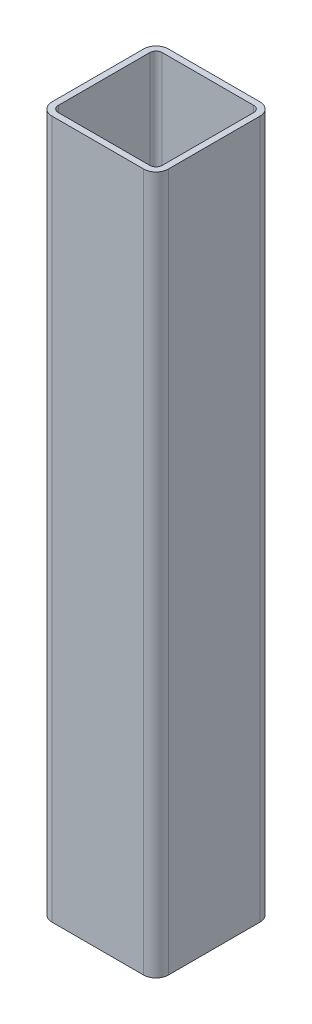
ISO-10303-21;
HEADER;
FILE_DESCRIPTION(('STEP AP214'),'2;1');
FILE_NAME('part.step','',(''),(''),'','','');
FILE_SCHEMA(('AUTOMOTIVE_DESIGN { 1 0 10303 214 1 1 1 1 }'));
ENDSEC;
DATA;
#1=APPLICATION_CONTEXT('core data for automotive mechanical design processes');
#2=APPLICATION_PROTOCOL_DEFINITION('international standard','automotive_design',2000,#1);
#3=PRODUCT_CONTEXT('',#1,'mechanical');
#4=PRODUCT('Part','Part','',(#3));
#5=PRODUCT_RELATED_PRODUCT_CATEGORY('part','',(#4));
#6=PRODUCT_DEFINITION_FORMATION('','',#4);
#7=PRODUCT_DEFINITION_CONTEXT('part definition',#1,'design');
#8=PRODUCT_DEFINITION('design','',#6,#7);
#9=PRODUCT_DEFINITION_SHAPE('','',#8);
#10=(LENGTH_UNIT() NAMED_UNIT(*) SI_UNIT(.MILLI.,.METRE.));
#11=(NAMED_UNIT(*) PLANE_ANGLE_UNIT() SI_UNIT($,.RADIAN.));
#12=(NAMED_UNIT(*) SI_UNIT($,.STERADIAN.) SOLID_ANGLE_UNIT());
#13=UNCERTAINTY_MEASURE_WITH_UNIT(LENGTH_MEASURE(1.E-05),#10,'distance_accuracy_value','');
#14=(GEOMETRIC_REPRESENTATION_CONTEXT(3) GLOBAL_UNCERTAINTY_ASSIGNED_CONTEXT((#13)) GLOBAL_UNIT_ASSIGNED_CONTEXT((#10,
#11,#12)) REPRESENTATION_CONTEXT('',''));
#15=CARTESIAN_POINT('',(0.,0.,0.));
#16=DIRECTION('',(0.,0.,1.));
#17=DIRECTION('',(1.,0.,0.));
#18=AXIS2_PLACEMENT_3D('',#15,#16,#17);
#19=CARTESIAN_POINT('',(646.4,300.,-1193.6));
#20=DIRECTION('',(0.,-1.,0.));
#21=DIRECTION('',(0.,0.,-1.));
#22=AXIS2_PLACEMENT_3D('',#19,#20,#21);
#23=CYLINDRICAL_SURFACE('',#22,3.20000000000009);
#24=CARTESIAN_POINT('',(646.4,330.,-1193.6));
#25=DIRECTION('',(0.,-1.,0.));
#26=DIRECTION('',(0.,0.,-1.));
#27=AXIS2_PLACEMENT_3D('',#24,#25,#26);
#28=CIRCLE('',#27,3.20000000000009);
#29=CARTESIAN_POINT('',(643.2,330.,-1193.6));
#30=VERTEX_POINT('',#29);
#31=CARTESIAN_POINT('',(646.4,330.,-1196.8));
#32=VERTEX_POINT('',#31);
#33=EDGE_CURVE('E141',#30,#32,#28,.T.);
#34=ORIENTED_EDGE('',*,*,#33,.F.);
#35=DIRECTION('',(0.,1.,0.));
#36=VECTOR('',#35,1.);
#37=CARTESIAN_POINT('',(643.2,300.,-1193.6));
#38=LINE('',#37,#36);
#39=CARTESIAN_POINT('',(643.2,-30.,-1193.6));
#40=VERTEX_POINT('',#39);
#41=EDGE_CURVE('E140',#40,#30,#38,.T.);
#42=ORIENTED_EDGE('',*,*,#41,.F.);
#43=CARTESIAN_POINT('',(646.4,-30.,-1193.6));
#44=DIRECTION('',(0.,-1.,0.));
#45=DIRECTION('',(0.,0.,-1.));
#46=AXIS2_PLACEMENT_3D('',#43,#44,#45);
#47=CIRCLE('',#46,3.20000000000009);
#48=CARTESIAN_POINT('',(646.4,-30.,-1196.8));
#49=VERTEX_POINT('',#48);
#50=EDGE_CURVE('E19',#49,#40,#47,.F.);
#51=ORIENTED_EDGE('',*,*,#50,.F.);
#52=DIRECTION('',(0.,1.,0.));
#53=VECTOR('',#52,1.);
#54=CARTESIAN_POINT('',(646.4,300.,-1196.8));
#55=LINE('',#54,#53);
#56=EDGE_CURVE('E123',#32,#49,#55,.F.);
#57=ORIENTED_EDGE('',*,*,#56,.F.);
#58=EDGE_LOOP('',(#34,#42,#51,#57));
#59=FACE_BOUND('',#58,.T.);
#60=ADVANCED_FACE('F16',(#59),#23,.F.);
#61=CARTESIAN_POINT('',(693.6,300.,-1196.8));
#62=DIRECTION('',(0.,0.,1.));
#63=DIRECTION('',(1.,0.,0.));
#64=AXIS2_PLACEMENT_3D('',#61,#62,#63);
#65=PLANE('',#64);
#66=ORIENTED_EDGE('',*,*,#56,.T.);
#67=DIRECTION('',(1.,0.,0.));
#68=VECTOR('',#67,1.);
#69=CARTESIAN_POINT('',(-670.,-30.,-1196.8));
#70=LINE('',#69,#68);
#71=CARTESIAN_POINT('',(693.6,-30.,-1196.8));
#72=VERTEX_POINT('',#71);
#73=EDGE_CURVE('E136',#72,#49,#70,.F.);
#74=ORIENTED_EDGE('',*,*,#73,.F.);
#75=DIRECTION('',(0.,-1.,0.));
#76=VECTOR('',#75,1.);
#77=CARTESIAN_POINT('',(693.6,300.,-1196.8));
#78=LINE('',#77,#76);
#79=CARTESIAN_POINT('',(693.6,330.,-1196.8));
#80=VERTEX_POINT('',#79);
#81=EDGE_CURVE('E182',#72,#80,#78,.F.);
#82=ORIENTED_EDGE('',*,*,#81,.T.);
#83=DIRECTION('',(1.,0.,0.));
#84=VECTOR('',#83,1.);
#85=CARTESIAN_POINT('',(-3.33066907387547E-13,330.,-1196.8));
#86=LINE('',#85,#84);
#87=EDGE_CURVE('E209',#32,#80,#86,.T.);
#88=ORIENTED_EDGE('',*,*,#87,.F.);
#89=EDGE_LOOP('',(#66,#74,#82,#88));
#90=FACE_BOUND('',#89,.T.);
#91=ADVANCED_FACE('F243',(#90),#65,.T.);
#92=CARTESIAN_POINT('',(693.6,300.,-1193.6));
#93=DIRECTION('',(0.,-1.,0.));
#94=DIRECTION('',(0.,0.,-1.));
#95=AXIS2_PLACEMENT_3D('',#92,#93,#94);
#96=CYLINDRICAL_SURFACE('',#95,3.20000000000009);
#97=CARTESIAN_POINT('',(693.6,330.,-1193.6));
#98=DIRECTION('',(0.,-1.,0.));
#99=DIRECTION('',(0.,0.,-1.));
#100=AXIS2_PLACEMENT_3D('',#97,#98,#99);
#101=CIRCLE('',#100,3.20000000000009);
#102=CARTESIAN_POINT('',(696.8,330.,-1193.6));
#103=VERTEX_POINT('',#102);
#104=EDGE_CURVE('E207',#80,#103,#101,.T.);
#105=ORIENTED_EDGE('',*,*,#104,.F.);
#106=ORIENTED_EDGE('',*,*,#81,.F.);
#107=CARTESIAN_POINT('',(693.6,-30.,-1193.6));
#108=DIRECTION('',(0.,-1.,0.));
#109=DIRECTION('',(0.,0.,-1.));
#110=AXIS2_PLACEMENT_3D('',#107,#108,#109);
#111=CIRCLE('',#110,3.20000000000009);
#112=CARTESIAN_POINT('',(696.8,-30.,-1193.6));
#113=VERTEX_POINT('',#112);
#114=EDGE_CURVE('E219',#113,#72,#111,.F.);
#115=ORIENTED_EDGE('',*,*,#114,.F.);
#116=DIRECTION('',(0.,1.,0.));
#117=VECTOR('',#116,1.);
#118=CARTESIAN_POINT('',(696.8,300.,-1193.6));
#119=LINE('',#118,#117);
#120=EDGE_CURVE('E180',#103,#113,#119,.F.);
#121=ORIENTED_EDGE('',*,*,#120,.F.);
#122=EDGE_LOOP('',(#105,#106,#115,#121));
#123=FACE_BOUND('',#122,.T.);
#124=ADVANCED_FACE('F242',(#123),#96,.F.);
#125=CARTESIAN_POINT('',(696.8,300.,-1193.6));
#126=DIRECTION('',(-1.,0.,0.));
#127=DIRECTION('',(0.,0.,1.));
#128=AXIS2_PLACEMENT_3D('',#125,#126,#127);
#129=PLANE('',#128);
#130=ORIENTED_EDGE('',*,*,#120,.T.);
#131=DIRECTION('',(0.,0.,1.));
#132=VECTOR('',#131,1.);
#133=CARTESIAN_POINT('',(696.8,-30.,0.));
#134=LINE('',#133,#132);
#135=CARTESIAN_POINT('',(696.8,-30.,-1146.4));
#136=VERTEX_POINT('',#135);
#137=EDGE_CURVE('E221',#136,#113,#134,.F.);
#138=ORIENTED_EDGE('',*,*,#137,.F.);
#139=DIRECTION('',(0.,-1.,0.));
#140=VECTOR('',#139,1.);
#141=CARTESIAN_POINT('',(696.8,300.,-1146.4));
#142=LINE('',#141,#140);
#143=CARTESIAN_POINT('',(696.8,330.,-1146.4));
#144=VERTEX_POINT('',#143);
#145=EDGE_CURVE('E177',#136,#144,#142,.F.);
#146=ORIENTED_EDGE('',*,*,#145,.T.);
#147=DIRECTION('',(0.,0.,1.));
#148=VECTOR('',#147,1.);
#149=CARTESIAN_POINT('',(696.8,330.,-1170.));
#150=LINE('',#149,#148);
#151=EDGE_CURVE('E206',#103,#144,#150,.T.);
#152=ORIENTED_EDGE('',*,*,#151,.F.);
#153=EDGE_LOOP('',(#130,#138,#146,#152));
#154=FACE_BOUND('',#153,.T.);
#155=ADVANCED_FACE('F237',(#154),#129,.T.);
#156=CARTESIAN_POINT('',(693.6,300.,-1146.4));
#157=DIRECTION('',(0.,-1.,0.));
#158=DIRECTION('',(0.,0.,-1.));
#159=AXIS2_PLACEMENT_3D('',#156,#157,#158);
#160=CYLINDRICAL_SURFACE('',#159,3.20000000000009);
#161=CARTESIAN_POINT('',(693.6,330.,-1146.4));
#162=DIRECTION('',(0.,-1.,0.));
#163=DIRECTION('',(0.,0.,-1.));
#164=AXIS2_PLACEMENT_3D('',#161,#162,#163);
#165=CIRCLE('',#164,3.20000000000009);
#166=CARTESIAN_POINT('',(693.6,330.,-1143.2));
#167=VERTEX_POINT('',#166);
#168=EDGE_CURVE('E204',#144,#167,#165,.T.);
#169=ORIENTED_EDGE('',*,*,#168,.F.);
#170=ORIENTED_EDGE('',*,*,#145,.F.);
#171=CARTESIAN_POINT('',(693.6,-30.,-1146.4));
#172=DIRECTION('',(0.,-1.,0.));
#173=DIRECTION('',(0.,0.,-1.));
#174=AXIS2_PLACEMENT_3D('',#171,#172,#173);
#175=CIRCLE('',#174,3.20000000000009);
#176=CARTESIAN_POINT('',(693.6,-30.,-1143.2));
#177=VERTEX_POINT('',#176);
#178=EDGE_CURVE('E222',#177,#136,#175,.F.);
#179=ORIENTED_EDGE('',*,*,#178,.F.);
#180=DIRECTION('',(0.,1.,0.));
#181=VECTOR('',#180,1.);
#182=CARTESIAN_POINT('',(693.6,300.,-1143.2));
#183=LINE('',#182,#181);
#184=EDGE_CURVE('E175',#167,#177,#183,.F.);
#185=ORIENTED_EDGE('',*,*,#184,.F.);
#186=EDGE_LOOP('',(#169,#170,#179,#185));
#187=FACE_BOUND('',#186,.T.);
#188=ADVANCED_FACE('F233',(#187),#160,.F.);
#189=CARTESIAN_POINT('',(646.4,300.,-1143.2));
#190=DIRECTION('',(0.,0.,-1.));
#191=DIRECTION('',(-1.,0.,0.));
#192=AXIS2_PLACEMENT_3D('',#189,#190,#191);
#193=PLANE('',#192);
#194=ORIENTED_EDGE('',*,*,#184,.T.);
#195=DIRECTION('',(1.,0.,0.));
#196=VECTOR('',#195,1.);
#197=CARTESIAN_POINT('',(-670.,-30.,-1143.2));
#198=LINE('',#197,#196);
#199=CARTESIAN_POINT('',(646.4,-30.,-1143.2));
#200=VERTEX_POINT('',#199);
#201=EDGE_CURVE('E152',#200,#177,#198,.T.);
#202=ORIENTED_EDGE('',*,*,#201,.F.);
#203=DIRECTION('',(0.,-1.,0.));
#204=VECTOR('',#203,1.);
#205=CARTESIAN_POINT('',(646.4,300.,-1143.2));
#206=LINE('',#205,#204);
#207=CARTESIAN_POINT('',(646.4,330.,-1143.2));
#208=VERTEX_POINT('',#207);
#209=EDGE_CURVE('E146',#200,#208,#206,.F.);
#210=ORIENTED_EDGE('',*,*,#209,.T.);
#211=DIRECTION('',(1.,0.,0.));
#212=VECTOR('',#211,1.);
#213=CARTESIAN_POINT('',(-3.33066907387547E-13,330.,-1143.2));
#214=LINE('',#213,#212);
#215=EDGE_CURVE('E203',#167,#208,#214,.F.);
#216=ORIENTED_EDGE('',*,*,#215,.F.);
#217=EDGE_LOOP('',(#194,#202,#210,#216));
#218=FACE_BOUND('',#217,.T.);
#219=ADVANCED_FACE('F406',(#218),#193,.T.);
#220=CARTESIAN_POINT('',(646.4,300.,-1146.4));
#221=DIRECTION('',(0.,-1.,0.));
#222=DIRECTION('',(0.,0.,-1.));
#223=AXIS2_PLACEMENT_3D('',#220,#221,#222);
#224=CYLINDRICAL_SURFACE('',#223,3.19999999999987);
#225=CARTESIAN_POINT('',(646.4,330.,-1146.4));
#226=DIRECTION('',(0.,-1.,0.));
#227=DIRECTION('',(0.,0.,-1.));
#228=AXIS2_PLACEMENT_3D('',#225,#226,#227);
#229=CIRCLE('',#228,3.19999999999987);
#230=CARTESIAN_POINT('',(643.2,330.,-1146.4));
#231=VERTEX_POINT('',#230);
#232=EDGE_CURVE('E200',#208,#231,#229,.T.);
#233=ORIENTED_EDGE('',*,*,#232,.F.);
#234=ORIENTED_EDGE('',*,*,#209,.F.);
#235=CARTESIAN_POINT('',(646.4,-30.,-1146.4));
#236=DIRECTION('',(0.,-1.,0.));
#237=DIRECTION('',(0.,0.,-1.));
#238=AXIS2_PLACEMENT_3D('',#235,#236,#237);
#239=CIRCLE('',#238,3.19999999999987);
#240=CARTESIAN_POINT('',(643.2,-30.,-1146.4));
#241=VERTEX_POINT('',#240);
#242=EDGE_CURVE('E150',#241,#200,#239,.F.);
#243=ORIENTED_EDGE('',*,*,#242,.F.);
#244=DIRECTION('',(0.,1.,0.));
#245=VECTOR('',#244,1.);
#246=CARTESIAN_POINT('',(643.2,300.,-1146.4));
#247=LINE('',#246,#245);
#248=EDGE_CURVE('E145',#231,#241,#247,.F.);
#249=ORIENTED_EDGE('',*,*,#248,.F.);
#250=EDGE_LOOP('',(#233,#234,#243,#249));
#251=FACE_BOUND('',#250,.T.);
#252=ADVANCED_FACE('F397',(#251),#224,.F.);
#253=CARTESIAN_POINT('',(643.2,300.,-1146.4));
#254=DIRECTION('',(1.,0.,0.));
#255=DIRECTION('',(0.,0.,-1.));
#256=AXIS2_PLACEMENT_3D('',#253,#254,#255);
#257=PLANE('',#256);
#258=ORIENTED_EDGE('',*,*,#248,.T.);
#259=DIRECTION('',(0.,0.,1.));
#260=VECTOR('',#259,1.);
#261=CARTESIAN_POINT('',(643.2,-30.,0.));
#262=LINE('',#261,#260);
#263=EDGE_CURVE('E134',#40,#241,#262,.T.);
#264=ORIENTED_EDGE('',*,*,#263,.F.);
#265=ORIENTED_EDGE('',*,*,#41,.T.);
#266=DIRECTION('',(0.,0.,1.));
#267=VECTOR('',#266,1.);
#268=CARTESIAN_POINT('',(643.2,330.,-1170.));
#269=LINE('',#268,#267);
#270=EDGE_CURVE('E202',#231,#30,#269,.F.);
#271=ORIENTED_EDGE('',*,*,#270,.F.);
#272=EDGE_LOOP('',(#258,#264,#265,#271));
#273=FACE_BOUND('',#272,.T.);
#274=ADVANCED_FACE('F148',(#273),#257,.T.);
#275=CARTESIAN_POINT('',(700.,300.,-1193.6));
#276=DIRECTION('',(-1.,0.,0.));
#277=DIRECTION('',(0.,0.,1.));
#278=AXIS2_PLACEMENT_3D('',#275,#276,#277);
#279=PLANE('',#278);
#280=DIRECTION('',(0.,0.,1.));
#281=VECTOR('',#280,1.);
#282=CARTESIAN_POINT('',(700.,330.,-1170.));
#283=LINE('',#282,#281);
#284=CARTESIAN_POINT('',(700.,330.,-1146.4));
#285=VERTEX_POINT('',#284);
#286=CARTESIAN_POINT('',(700.,330.,-1193.6));
#287=VERTEX_POINT('',#286);
#288=EDGE_CURVE('E199',#285,#287,#283,.F.);
#289=ORIENTED_EDGE('',*,*,#288,.F.);
#290=DIRECTION('',(0.,-1.,0.));
#291=VECTOR('',#290,1.);
#292=CARTESIAN_POINT('',(700.,300.,-1146.4));
#293=LINE('',#292,#291);
#294=CARTESIAN_POINT('',(700.,-30.,-1146.4));
#295=VERTEX_POINT('',#294);
#296=EDGE_CURVE('E159',#295,#285,#293,.F.);
#297=ORIENTED_EDGE('',*,*,#296,.F.);
#298=DIRECTION('',(0.,0.,1.));
#299=VECTOR('',#298,1.);
#300=CARTESIAN_POINT('',(700.,-30.,0.));
#301=LINE('',#300,#299);
#302=CARTESIAN_POINT('',(700.,-30.,-1193.6));
#303=VERTEX_POINT('',#302);
#304=EDGE_CURVE('E214',#303,#295,#301,.T.);
#305=ORIENTED_EDGE('',*,*,#304,.F.);
#306=DIRECTION('',(0.,-1.,0.));
#307=VECTOR('',#306,1.);
#308=CARTESIAN_POINT('',(700.,300.,-1193.6));
#309=LINE('',#308,#307);
#310=EDGE_CURVE('E170',#287,#303,#309,.T.);
#311=ORIENTED_EDGE('',*,*,#310,.F.);
#312=EDGE_LOOP('',(#289,#297,#305,#311));
#313=FACE_BOUND('',#312,.T.);
#314=ADVANCED_FACE('F280',(#313),#279,.F.);
#315=CARTESIAN_POINT('',(693.6,300.,-1193.6));
#316=DIRECTION('',(0.,-1.,0.));
#317=DIRECTION('',(0.,0.,-1.));
#318=AXIS2_PLACEMENT_3D('',#315,#316,#317);
#319=CYLINDRICAL_SURFACE('',#318,6.39999999999996);
#320=ORIENTED_EDGE('',*,*,#310,.T.);
#321=CARTESIAN_POINT('',(693.6,-30.,-1193.6));
#322=DIRECTION('',(0.,-1.,0.));
#323=DIRECTION('',(0.,0.,-1.));
#324=AXIS2_PLACEMENT_3D('',#321,#322,#323);
#325=CIRCLE('',#324,6.39999999999996);
#326=CARTESIAN_POINT('',(693.6,-30.,-1200.));
#327=VERTEX_POINT('',#326);
#328=EDGE_CURVE('E215',#327,#303,#325,.T.);
#329=ORIENTED_EDGE('',*,*,#328,.F.);
#330=DIRECTION('',(0.,1.,0.));
#331=VECTOR('',#330,1.);
#332=CARTESIAN_POINT('',(693.6,300.,-1200.));
#333=LINE('',#332,#331);
#334=CARTESIAN_POINT('',(693.6,330.,-1200.));
#335=VERTEX_POINT('',#334);
#336=EDGE_CURVE('E161',#327,#335,#333,.T.);
#337=ORIENTED_EDGE('',*,*,#336,.T.);
#338=CARTESIAN_POINT('',(693.6,330.,-1193.6));
#339=DIRECTION('',(0.,-1.,0.));
#340=DIRECTION('',(0.,0.,-1.));
#341=AXIS2_PLACEMENT_3D('',#338,#339,#340);
#342=CIRCLE('',#341,6.39999999999996);
#343=EDGE_CURVE('E197',#287,#335,#342,.F.);
#344=ORIENTED_EDGE('',*,*,#343,.F.);
#345=EDGE_LOOP('',(#320,#329,#337,#344));
#346=FACE_BOUND('',#345,.T.);
#347=ADVANCED_FACE('F287',(#346),#319,.T.);
#348=CARTESIAN_POINT('',(693.6,300.,-1200.));
#349=DIRECTION('',(0.,0.,1.));
#350=DIRECTION('',(1.,0.,0.));
#351=AXIS2_PLACEMENT_3D('',#348,#349,#350);
#352=PLANE('',#351);
#353=DIRECTION('',(1.,0.,0.));
#354=VECTOR('',#353,1.);
#355=CARTESIAN_POINT('',(-3.33066907387547E-13,330.,-1200.));
#356=LINE('',#355,#354);
#357=CARTESIAN_POINT('',(646.4,330.,-1200.));
#358=VERTEX_POINT('',#357);
#359=EDGE_CURVE('E196',#335,#358,#356,.F.);
#360=ORIENTED_EDGE('',*,*,#359,.F.);
#361=ORIENTED_EDGE('',*,*,#336,.F.);
#362=DIRECTION('',(1.,0.,0.));
#363=VECTOR('',#362,1.);
#364=CARTESIAN_POINT('',(-670.,-30.,-1200.));
#365=LINE('',#364,#363);
#366=CARTESIAN_POINT('',(646.4,-30.,-1200.));
#367=VERTEX_POINT('',#366);
#368=EDGE_CURVE('E218',#367,#327,#365,.T.);
#369=ORIENTED_EDGE('',*,*,#368,.F.);
#370=DIRECTION('',(0.,-1.,0.));
#371=VECTOR('',#370,1.);
#372=CARTESIAN_POINT('',(646.4,300.,-1200.));
#373=LINE('',#372,#371);
#374=EDGE_CURVE('E164',#358,#367,#373,.T.);
#375=ORIENTED_EDGE('',*,*,#374,.F.);
#376=EDGE_LOOP('',(#360,#361,#369,#375));
#377=FACE_BOUND('',#376,.T.);
#378=ADVANCED_FACE('F290',(#377),#352,.F.);
#379=CARTESIAN_POINT('',(693.6,300.,-1146.4));
#380=DIRECTION('',(0.,-1.,0.));
#381=DIRECTION('',(0.,0.,-1.));
#382=AXIS2_PLACEMENT_3D('',#379,#380,#381);
#383=CYLINDRICAL_SURFACE('',#382,6.39999999999996);
#384=DIRECTION('',(0.,1.,0.));
#385=VECTOR('',#384,1.);
#386=CARTESIAN_POINT('',(693.6,300.,-1140.));
#387=LINE('',#386,#385);
#388=CARTESIAN_POINT('',(693.6,330.,-1140.));
#389=VERTEX_POINT('',#388);
#390=CARTESIAN_POINT('',(693.6,-30.,-1140.));
#391=VERTEX_POINT('',#390);
#392=EDGE_CURVE('E138',#389,#391,#387,.F.);
#393=ORIENTED_EDGE('',*,*,#392,.T.);
#394=CARTESIAN_POINT('',(693.6,-30.,-1146.4));
#395=DIRECTION('',(0.,-1.,0.));
#396=DIRECTION('',(0.,0.,-1.));
#397=AXIS2_PLACEMENT_3D('',#394,#395,#396);
#398=CIRCLE('',#397,6.39999999999996);
#399=EDGE_CURVE('E212',#295,#391,#398,.T.);
#400=ORIENTED_EDGE('',*,*,#399,.F.);
#401=ORIENTED_EDGE('',*,*,#296,.T.);
#402=CARTESIAN_POINT('',(693.6,330.,-1146.4));
#403=DIRECTION('',(0.,-1.,0.));
#404=DIRECTION('',(0.,0.,-1.));
#405=AXIS2_PLACEMENT_3D('',#402,#403,#404);
#406=CIRCLE('',#405,6.39999999999996);
#407=EDGE_CURVE('E158',#389,#285,#406,.F.);
#408=ORIENTED_EDGE('',*,*,#407,.F.);
#409=EDGE_LOOP('',(#393,#400,#401,#408));
#410=FACE_BOUND('',#409,.T.);
#411=ADVANCED_FACE('F274',(#410),#383,.T.);
#412=CARTESIAN_POINT('',(646.4,300.,-1140.));
#413=DIRECTION('',(0.,0.,-1.));
#414=DIRECTION('',(-1.,0.,0.));
#415=AXIS2_PLACEMENT_3D('',#412,#413,#414);
#416=PLANE('',#415);
#417=DIRECTION('',(1.,0.,0.));
#418=VECTOR('',#417,1.);
#419=CARTESIAN_POINT('',(-3.33066907387547E-13,330.,-1140.));
#420=LINE('',#419,#418);
#421=CARTESIAN_POINT('',(646.4,330.,-1140.));
#422=VERTEX_POINT('',#421);
#423=EDGE_CURVE('E193',#422,#389,#420,.T.);
#424=ORIENTED_EDGE('',*,*,#423,.F.);
#425=DIRECTION('',(0.,-1.,0.));
#426=VECTOR('',#425,1.);
#427=CARTESIAN_POINT('',(646.4,300.,-1140.));
#428=LINE('',#427,#426);
#429=CARTESIAN_POINT('',(646.4,-30.,-1140.));
#430=VERTEX_POINT('',#429);
#431=EDGE_CURVE('E156',#430,#422,#428,.F.);
#432=ORIENTED_EDGE('',*,*,#431,.F.);
#433=DIRECTION('',(1.,0.,0.));
#434=VECTOR('',#433,1.);
#435=CARTESIAN_POINT('',(-670.,-30.,-1140.));
#436=LINE('',#435,#434);
#437=EDGE_CURVE('E167',#391,#430,#436,.F.);
#438=ORIENTED_EDGE('',*,*,#437,.F.);
#439=ORIENTED_EDGE('',*,*,#392,.F.);
#440=EDGE_LOOP('',(#424,#432,#438,#439));
#441=FACE_BOUND('',#440,.T.);
#442=ADVANCED_FACE('F304',(#441),#416,.F.);
#443=CARTESIAN_POINT('',(-670.,-30.,0.));
#444=DIRECTION('',(0.,-1.,0.));
#445=DIRECTION('',(1.,0.,0.));
#446=AXIS2_PLACEMENT_3D('',#443,#444,#445);
#447=PLANE('',#446);
#448=DIRECTION('',(0.,0.,-1.));
#449=VECTOR('',#448,1.);
#450=CARTESIAN_POINT('',(640.,-30.,-1146.4));
#451=LINE('',#450,#449);
#452=CARTESIAN_POINT('',(640.,-30.,-1146.4));
#453=VERTEX_POINT('',#452);
#454=CARTESIAN_POINT('',(640.,-30.,-1193.6));
#455=VERTEX_POINT('',#454);
#456=EDGE_CURVE('E189',#453,#455,#451,.T.);
#457=ORIENTED_EDGE('',*,*,#456,.T.);
#458=CARTESIAN_POINT('',(646.4,-30.,-1193.6));
#459=DIRECTION('',(0.,-1.,0.));
#460=DIRECTION('',(0.,0.,-1.));
#461=AXIS2_PLACEMENT_3D('',#458,#459,#460);
#462=CIRCLE('',#461,6.39999999999996);
#463=EDGE_CURVE('E166',#367,#455,#462,.F.);
#464=ORIENTED_EDGE('',*,*,#463,.F.);
#465=ORIENTED_EDGE('',*,*,#368,.T.);
#466=ORIENTED_EDGE('',*,*,#328,.T.);
#467=ORIENTED_EDGE('',*,*,#304,.T.);
#468=ORIENTED_EDGE('',*,*,#399,.T.);
#469=ORIENTED_EDGE('',*,*,#437,.T.);
#470=CARTESIAN_POINT('',(646.4,-30.,-1146.4));
#471=DIRECTION('',(0.,-1.,0.));
#472=DIRECTION('',(0.,0.,-1.));
#473=AXIS2_PLACEMENT_3D('',#470,#471,#472);
#474=CIRCLE('',#473,6.39999999999996);
#475=EDGE_CURVE('E186',#453,#430,#474,.F.);
#476=ORIENTED_EDGE('',*,*,#475,.F.);
#477=EDGE_LOOP('',(#457,#464,#465,#466,#467,#468,#469,#476));
#478=FACE_BOUND('',#477,.T.);
#479=ORIENTED_EDGE('',*,*,#114,.T.);
#480=ORIENTED_EDGE('',*,*,#73,.T.);
#481=ORIENTED_EDGE('',*,*,#50,.T.);
#482=ORIENTED_EDGE('',*,*,#263,.T.);
#483=ORIENTED_EDGE('',*,*,#242,.T.);
#484=ORIENTED_EDGE('',*,*,#201,.T.);
#485=ORIENTED_EDGE('',*,*,#178,.T.);
#486=ORIENTED_EDGE('',*,*,#137,.T.);
#487=EDGE_LOOP('',(#479,#480,#481,#482,#483,#484,#485,#486));
#488=FACE_BOUND('',#487,.T.);
#489=ADVANCED_FACE('F131',(#478,#488),#447,.T.);
#490=CARTESIAN_POINT('',(646.4,300.,-1193.6));
#491=DIRECTION('',(0.,-1.,0.));
#492=DIRECTION('',(0.,0.,-1.));
#493=AXIS2_PLACEMENT_3D('',#490,#491,#492);
#494=CYLINDRICAL_SURFACE('',#493,6.39999999999996);
#495=ORIENTED_EDGE('',*,*,#374,.T.);
#496=ORIENTED_EDGE('',*,*,#463,.T.);
#497=DIRECTION('',(0.,1.,0.));
#498=VECTOR('',#497,1.);
#499=CARTESIAN_POINT('',(640.,300.,-1193.6));
#500=LINE('',#499,#498);
#501=CARTESIAN_POINT('',(640.,330.,-1193.6));
#502=VERTEX_POINT('',#501);
#503=EDGE_CURVE('E252',#455,#502,#500,.T.);
#504=ORIENTED_EDGE('',*,*,#503,.T.);
#505=CARTESIAN_POINT('',(646.4,330.,-1193.6));
#506=DIRECTION('',(0.,-1.,0.));
#507=DIRECTION('',(0.,0.,-1.));
#508=AXIS2_PLACEMENT_3D('',#505,#506,#507);
#509=CIRCLE('',#508,6.39999999999996);
#510=EDGE_CURVE('E194',#358,#502,#509,.F.);
#511=ORIENTED_EDGE('',*,*,#510,.F.);
#512=EDGE_LOOP('',(#495,#496,#504,#511));
#513=FACE_BOUND('',#512,.T.);
#514=ADVANCED_FACE('F294',(#513),#494,.T.);
#515=CARTESIAN_POINT('',(-3.33066907387547E-13,330.,-1170.));
#516=DIRECTION('',(0.,1.,0.));
#517=DIRECTION('',(0.,0.,1.));
#518=AXIS2_PLACEMENT_3D('',#515,#516,#517);
#519=PLANE('',#518);
#520=ORIENTED_EDGE('',*,*,#423,.T.);
#521=ORIENTED_EDGE('',*,*,#407,.T.);
#522=ORIENTED_EDGE('',*,*,#288,.T.);
#523=ORIENTED_EDGE('',*,*,#343,.T.);
#524=ORIENTED_EDGE('',*,*,#359,.T.);
#525=ORIENTED_EDGE('',*,*,#510,.T.);
#526=DIRECTION('',(0.,0.,-1.));
#527=VECTOR('',#526,1.);
#528=CARTESIAN_POINT('',(640.,330.,-1146.4));
#529=LINE('',#528,#527);
#530=CARTESIAN_POINT('',(640.,330.,-1146.4));
#531=VERTEX_POINT('',#530);
#532=EDGE_CURVE('E25',#502,#531,#529,.F.);
#533=ORIENTED_EDGE('',*,*,#532,.T.);
#534=CARTESIAN_POINT('',(646.4,330.,-1146.4));
#535=DIRECTION('',(0.,-1.,0.));
#536=DIRECTION('',(0.,0.,-1.));
#537=AXIS2_PLACEMENT_3D('',#534,#535,#536);
#538=CIRCLE('',#537,6.39999999999996);
#539=EDGE_CURVE('E33',#422,#531,#538,.T.);
#540=ORIENTED_EDGE('',*,*,#539,.F.);
#541=EDGE_LOOP('',(#520,#521,#522,#523,#524,#525,#533,#540));
#542=FACE_BOUND('',#541,.T.);
#543=ORIENTED_EDGE('',*,*,#232,.T.);
#544=ORIENTED_EDGE('',*,*,#270,.T.);
#545=ORIENTED_EDGE('',*,*,#33,.T.);
#546=ORIENTED_EDGE('',*,*,#87,.T.);
#547=ORIENTED_EDGE('',*,*,#104,.T.);
#548=ORIENTED_EDGE('',*,*,#151,.T.);
#549=ORIENTED_EDGE('',*,*,#168,.T.);
#550=ORIENTED_EDGE('',*,*,#215,.T.);
#551=EDGE_LOOP('',(#543,#544,#545,#546,#547,#548,#549,#550));
#552=FACE_BOUND('',#551,.T.);
#553=ADVANCED_FACE('F268',(#542,#552),#519,.T.);
#554=CARTESIAN_POINT('',(646.4,300.,-1146.4));
#555=DIRECTION('',(0.,-1.,0.));
#556=DIRECTION('',(0.,0.,-1.));
#557=AXIS2_PLACEMENT_3D('',#554,#555,#556);
#558=CYLINDRICAL_SURFACE('',#557,6.39999999999996);
#559=DIRECTION('',(0.,1.,0.));
#560=VECTOR('',#559,1.);
#561=CARTESIAN_POINT('',(640.,300.,-1146.4));
#562=LINE('',#561,#560);
#563=EDGE_CURVE('E11',#531,#453,#562,.F.);
#564=ORIENTED_EDGE('',*,*,#563,.T.);
#565=ORIENTED_EDGE('',*,*,#475,.T.);
#566=ORIENTED_EDGE('',*,*,#431,.T.);
#567=ORIENTED_EDGE('',*,*,#539,.T.);
#568=EDGE_LOOP('',(#564,#565,#566,#567));
#569=FACE_BOUND('',#568,.T.);
#570=ADVANCED_FACE('F301',(#569),#558,.T.);
#571=CARTESIAN_POINT('',(640.,300.,-1146.4));
#572=DIRECTION('',(1.,0.,0.));
#573=DIRECTION('',(0.,0.,-1.));
#574=AXIS2_PLACEMENT_3D('',#571,#572,#573);
#575=PLANE('',#574);
#576=ORIENTED_EDGE('',*,*,#532,.F.);
#577=ORIENTED_EDGE('',*,*,#503,.F.);
#578=ORIENTED_EDGE('',*,*,#456,.F.);
#579=ORIENTED_EDGE('',*,*,#563,.F.);
#580=EDGE_LOOP('',(#576,#577,#578,#579));
#581=FACE_BOUND('',#580,.T.);
#582=ADVANCED_FACE('F298',(#581),#575,.F.);
#583=CLOSED_SHELL('',(#60,#91,#124,#155,#188,#219,#252,#274,#314,#347,#378,#411,#442,#489,#514,
#553,#570,#582));
#584=MANIFOLD_SOLID_BREP('B1',#583);
#585=ADVANCED_BREP_SHAPE_REPRESENTATION('',(#18,#584),#14);
#586=SHAPE_DEFINITION_REPRESENTATION(#9,#585);
ENDSEC;
END-ISO-10303-21;
